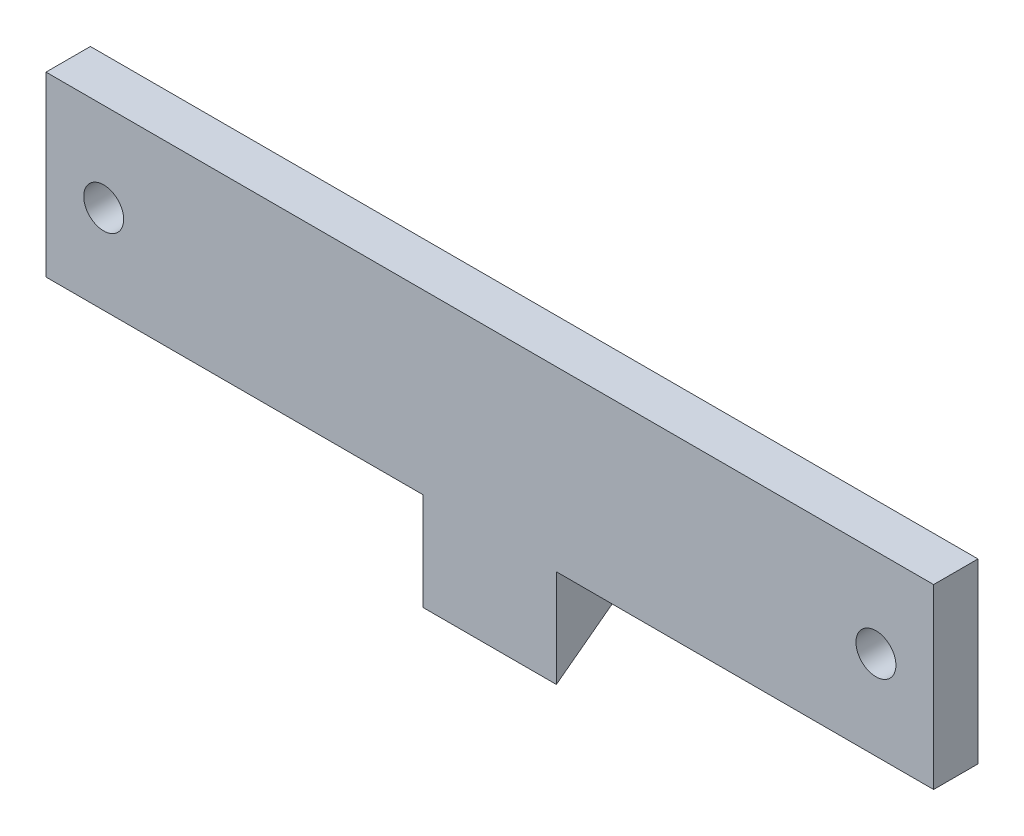
ISO-10303-21;
HEADER;
FILE_DESCRIPTION(('STEP AP214'),'2;1');
FILE_NAME('part.step','',(''),(''),'','','');
FILE_SCHEMA(('AUTOMOTIVE_DESIGN { 1 0 10303 214 1 1 1 1 }'));
ENDSEC;
DATA;
#1=APPLICATION_CONTEXT('core data for automotive mechanical design processes');
#2=APPLICATION_PROTOCOL_DEFINITION('international standard','automotive_design',2000,#1);
#3=PRODUCT_CONTEXT('',#1,'mechanical');
#4=PRODUCT('Part','Part','',(#3));
#5=PRODUCT_RELATED_PRODUCT_CATEGORY('part','',(#4));
#6=PRODUCT_DEFINITION_FORMATION('','',#4);
#7=PRODUCT_DEFINITION_CONTEXT('part definition',#1,'design');
#8=PRODUCT_DEFINITION('design','',#6,#7);
#9=PRODUCT_DEFINITION_SHAPE('','',#8);
#10=(LENGTH_UNIT() NAMED_UNIT(*) SI_UNIT(.MILLI.,.METRE.));
#11=(NAMED_UNIT(*) PLANE_ANGLE_UNIT() SI_UNIT($,.RADIAN.));
#12=(NAMED_UNIT(*) SI_UNIT($,.STERADIAN.) SOLID_ANGLE_UNIT());
#13=UNCERTAINTY_MEASURE_WITH_UNIT(LENGTH_MEASURE(1.E-05),#10,'distance_accuracy_value','');
#14=(GEOMETRIC_REPRESENTATION_CONTEXT(3) GLOBAL_UNCERTAINTY_ASSIGNED_CONTEXT((#13)) GLOBAL_UNIT_ASSIGNED_CONTEXT((#10,
#11,#12)) REPRESENTATION_CONTEXT('',''));
#15=CARTESIAN_POINT('',(0.,0.,0.));
#16=DIRECTION('',(0.,0.,1.));
#17=DIRECTION('',(1.,0.,0.));
#18=AXIS2_PLACEMENT_3D('',#15,#16,#17);
#19=CARTESIAN_POINT('',(-50.,-10.,5.));
#20=DIRECTION('',(0.,1.,0.));
#21=DIRECTION('',(0.,0.,1.));
#22=AXIS2_PLACEMENT_3D('',#19,#20,#21);
#23=PLANE('',#22);
#24=DIRECTION('',(1.,0.,0.));
#25=VECTOR('',#24,1.);
#26=CARTESIAN_POINT('',(-50.,-10.,5.));
#27=LINE('',#26,#25);
#28=CARTESIAN_POINT('',(7.5,-10.,5.));
#29=VERTEX_POINT('',#28);
#30=CARTESIAN_POINT('',(50.,-10.,5.));
#31=VERTEX_POINT('',#30);
#32=EDGE_CURVE('E68',#29,#31,#27,.T.);
#33=ORIENTED_EDGE('',*,*,#32,.F.);
#34=DIRECTION('',(0.,0.,-1.));
#35=VECTOR('',#34,1.);
#36=CARTESIAN_POINT('',(7.5,-10.,5.));
#37=LINE('',#36,#35);
#38=CARTESIAN_POINT('',(7.5,-10.,0.));
#39=VERTEX_POINT('',#38);
#40=EDGE_CURVE('E164',#29,#39,#37,.T.);
#41=ORIENTED_EDGE('',*,*,#40,.T.);
#42=DIRECTION('',(1.,0.,0.));
#43=VECTOR('',#42,1.);
#44=CARTESIAN_POINT('',(-50.,-10.,0.));
#45=LINE('',#44,#43);
#46=CARTESIAN_POINT('',(50.,-10.,0.));
#47=VERTEX_POINT('',#46);
#48=EDGE_CURVE('E90',#39,#47,#45,.T.);
#49=ORIENTED_EDGE('',*,*,#48,.T.);
#50=DIRECTION('',(0.,0.,-1.));
#51=VECTOR('',#50,1.);
#52=CARTESIAN_POINT('',(50.,-10.,5.));
#53=LINE('',#52,#51);
#54=EDGE_CURVE('E207',#31,#47,#53,.T.);
#55=ORIENTED_EDGE('',*,*,#54,.F.);
#56=EDGE_LOOP('',(#33,#41,#49,#55));
#57=FACE_BOUND('',#56,.T.);
#58=ADVANCED_FACE('F43',(#57),#23,.F.);
#59=CARTESIAN_POINT('',(50.,10.,5.));
#60=DIRECTION('',(-1.,0.,0.));
#61=DIRECTION('',(0.,0.,1.));
#62=AXIS2_PLACEMENT_3D('',#59,#60,#61);
#63=PLANE('',#62);
#64=DIRECTION('',(0.,1.,0.));
#65=VECTOR('',#64,1.);
#66=CARTESIAN_POINT('',(50.,10.,0.));
#67=LINE('',#66,#65);
#68=CARTESIAN_POINT('',(50.,10.,0.));
#69=VERTEX_POINT('',#68);
#70=EDGE_CURVE('E193',#47,#69,#67,.T.);
#71=ORIENTED_EDGE('',*,*,#70,.T.);
#72=DIRECTION('',(0.,0.,-1.));
#73=VECTOR('',#72,1.);
#74=CARTESIAN_POINT('',(50.,10.,5.));
#75=LINE('',#74,#73);
#76=CARTESIAN_POINT('',(50.,10.,5.));
#77=VERTEX_POINT('',#76);
#78=EDGE_CURVE('E11',#77,#69,#75,.T.);
#79=ORIENTED_EDGE('',*,*,#78,.F.);
#80=DIRECTION('',(0.,1.,0.));
#81=VECTOR('',#80,1.);
#82=CARTESIAN_POINT('',(50.,10.,5.));
#83=LINE('',#82,#81);
#84=EDGE_CURVE('E194',#31,#77,#83,.T.);
#85=ORIENTED_EDGE('',*,*,#84,.F.);
#86=ORIENTED_EDGE('',*,*,#54,.T.);
#87=EDGE_LOOP('',(#71,#79,#85,#86));
#88=FACE_BOUND('',#87,.T.);
#89=ADVANCED_FACE('F45',(#88),#63,.F.);
#90=CARTESIAN_POINT('',(-50.,10.,5.));
#91=DIRECTION('',(0.,-1.,0.));
#92=DIRECTION('',(0.,0.,-1.));
#93=AXIS2_PLACEMENT_3D('',#90,#91,#92);
#94=PLANE('',#93);
#95=DIRECTION('',(-1.,0.,0.));
#96=VECTOR('',#95,1.);
#97=CARTESIAN_POINT('',(-50.,10.,0.));
#98=LINE('',#97,#96);
#99=CARTESIAN_POINT('',(-50.,10.,0.));
#100=VERTEX_POINT('',#99);
#101=EDGE_CURVE('E211',#69,#100,#98,.T.);
#102=ORIENTED_EDGE('',*,*,#101,.T.);
#103=DIRECTION('',(0.,0.,-1.));
#104=VECTOR('',#103,1.);
#105=CARTESIAN_POINT('',(-50.,10.,5.));
#106=LINE('',#105,#104);
#107=CARTESIAN_POINT('',(-50.,10.,5.));
#108=VERTEX_POINT('',#107);
#109=EDGE_CURVE('E52',#108,#100,#106,.T.);
#110=ORIENTED_EDGE('',*,*,#109,.F.);
#111=DIRECTION('',(-1.,0.,0.));
#112=VECTOR('',#111,1.);
#113=CARTESIAN_POINT('',(-50.,10.,5.));
#114=LINE('',#113,#112);
#115=EDGE_CURVE('E97',#77,#108,#114,.T.);
#116=ORIENTED_EDGE('',*,*,#115,.F.);
#117=ORIENTED_EDGE('',*,*,#78,.T.);
#118=EDGE_LOOP('',(#102,#110,#116,#117));
#119=FACE_BOUND('',#118,.T.);
#120=ADVANCED_FACE('F246',(#119),#94,.F.);
#121=CARTESIAN_POINT('',(-50.,10.,5.));
#122=DIRECTION('',(1.,0.,0.));
#123=DIRECTION('',(0.,0.,-1.));
#124=AXIS2_PLACEMENT_3D('',#121,#122,#123);
#125=PLANE('',#124);
#126=DIRECTION('',(0.,-1.,0.));
#127=VECTOR('',#126,1.);
#128=CARTESIAN_POINT('',(-50.,10.,0.));
#129=LINE('',#128,#127);
#130=CARTESIAN_POINT('',(-50.,-10.,0.));
#131=VERTEX_POINT('',#130);
#132=EDGE_CURVE('E214',#100,#131,#129,.T.);
#133=ORIENTED_EDGE('',*,*,#132,.T.);
#134=DIRECTION('',(0.,0.,-1.));
#135=VECTOR('',#134,1.);
#136=CARTESIAN_POINT('',(-50.,-10.,5.));
#137=LINE('',#136,#135);
#138=CARTESIAN_POINT('',(-50.,-10.,5.));
#139=VERTEX_POINT('',#138);
#140=EDGE_CURVE('E222',#139,#131,#137,.T.);
#141=ORIENTED_EDGE('',*,*,#140,.F.);
#142=DIRECTION('',(0.,-1.,0.));
#143=VECTOR('',#142,1.);
#144=CARTESIAN_POINT('',(-50.,10.,5.));
#145=LINE('',#144,#143);
#146=EDGE_CURVE('E200',#108,#139,#145,.T.);
#147=ORIENTED_EDGE('',*,*,#146,.F.);
#148=ORIENTED_EDGE('',*,*,#109,.T.);
#149=EDGE_LOOP('',(#133,#141,#147,#148));
#150=FACE_BOUND('',#149,.T.);
#151=ADVANCED_FACE('F230',(#150),#125,.F.);
#152=CARTESIAN_POINT('',(-7.5,-10.,0.));
#153=VERTEX_POINT('',#152);
#154=EDGE_CURVE('E197',#131,#153,#45,.T.);
#155=ORIENTED_EDGE('',*,*,#154,.T.);
#156=DIRECTION('',(0.,0.,1.));
#157=VECTOR('',#156,1.);
#158=CARTESIAN_POINT('',(-7.5,-10.,5.));
#159=LINE('',#158,#157);
#160=CARTESIAN_POINT('',(-7.5,-10.,5.));
#161=VERTEX_POINT('',#160);
#162=EDGE_CURVE('E159',#153,#161,#159,.T.);
#163=ORIENTED_EDGE('',*,*,#162,.T.);
#164=EDGE_CURVE('E203',#139,#161,#27,.T.);
#165=ORIENTED_EDGE('',*,*,#164,.F.);
#166=ORIENTED_EDGE('',*,*,#140,.T.);
#167=EDGE_LOOP('',(#155,#163,#165,#166));
#168=FACE_BOUND('',#167,.T.);
#169=ADVANCED_FACE('F240',(#168),#23,.F.);
#170=CARTESIAN_POINT('',(0.,0.,5.));
#171=DIRECTION('',(0.,0.,1.));
#172=DIRECTION('',(1.,0.,0.));
#173=AXIS2_PLACEMENT_3D('',#170,#171,#172);
#174=PLANE('',#173);
#175=CARTESIAN_POINT('',(-43.5,0.,5.));
#176=DIRECTION('',(0.,0.,1.));
#177=DIRECTION('',(1.,0.,0.));
#178=AXIS2_PLACEMENT_3D('',#175,#176,#177);
#179=CIRCLE('',#178,2.24999999999999);
#180=CARTESIAN_POINT('',(-41.25,0.,5.));
#181=VERTEX_POINT('',#180);
#182=EDGE_CURVE('E175',#181,#181,#179,.T.);
#183=ORIENTED_EDGE('',*,*,#182,.F.);
#184=EDGE_LOOP('',(#183));
#185=FACE_BOUND('',#184,.T.);
#186=CARTESIAN_POINT('',(43.5,0.,5.));
#187=DIRECTION('',(0.,0.,1.));
#188=DIRECTION('',(1.,0.,0.));
#189=AXIS2_PLACEMENT_3D('',#186,#187,#188);
#190=CIRCLE('',#189,2.24999999999999);
#191=CARTESIAN_POINT('',(45.75,0.,5.));
#192=VERTEX_POINT('',#191);
#193=EDGE_CURVE('E185',#192,#192,#190,.T.);
#194=ORIENTED_EDGE('',*,*,#193,.F.);
#195=EDGE_LOOP('',(#194));
#196=FACE_BOUND('',#195,.T.);
#197=ORIENTED_EDGE('',*,*,#84,.T.);
#198=ORIENTED_EDGE('',*,*,#115,.T.);
#199=ORIENTED_EDGE('',*,*,#146,.T.);
#200=ORIENTED_EDGE('',*,*,#164,.T.);
#201=DIRECTION('',(0.,1.,0.));
#202=VECTOR('',#201,1.);
#203=CARTESIAN_POINT('',(-7.5,-15.,5.));
#204=LINE('',#203,#202);
#205=CARTESIAN_POINT('',(-7.5,-21.,5.));
#206=VERTEX_POINT('',#205);
#207=EDGE_CURVE('E59',#206,#161,#204,.T.);
#208=ORIENTED_EDGE('',*,*,#207,.F.);
#209=DIRECTION('',(-1.,0.,0.));
#210=VECTOR('',#209,1.);
#211=CARTESIAN_POINT('',(-7.5,-21.,5.));
#212=LINE('',#211,#210);
#213=CARTESIAN_POINT('',(7.5,-21.,5.));
#214=VERTEX_POINT('',#213);
#215=EDGE_CURVE('E141',#214,#206,#212,.T.);
#216=ORIENTED_EDGE('',*,*,#215,.F.);
#217=DIRECTION('',(0.,1.,0.));
#218=VECTOR('',#217,1.);
#219=CARTESIAN_POINT('',(7.5,-15.,5.));
#220=LINE('',#219,#218);
#221=EDGE_CURVE('E149',#214,#29,#220,.T.);
#222=ORIENTED_EDGE('',*,*,#221,.T.);
#223=ORIENTED_EDGE('',*,*,#32,.T.);
#224=EDGE_LOOP('',(#197,#198,#199,#200,#208,#216,#222,#223));
#225=FACE_BOUND('',#224,.T.);
#226=ADVANCED_FACE('F242',(#185,#196,#225),#174,.T.);
#227=CARTESIAN_POINT('',(0.,0.,0.));
#228=DIRECTION('',(0.,0.,1.));
#229=DIRECTION('',(1.,0.,0.));
#230=AXIS2_PLACEMENT_3D('',#227,#228,#229);
#231=PLANE('',#230);
#232=CARTESIAN_POINT('',(-43.5,0.,0.));
#233=DIRECTION('',(0.,0.,1.));
#234=DIRECTION('',(1.,0.,0.));
#235=AXIS2_PLACEMENT_3D('',#232,#233,#234);
#236=CIRCLE('',#235,2.25);
#237=CARTESIAN_POINT('',(-41.25,0.,0.));
#238=VERTEX_POINT('',#237);
#239=EDGE_CURVE('E181',#238,#238,#236,.T.);
#240=ORIENTED_EDGE('',*,*,#239,.T.);
#241=EDGE_LOOP('',(#240));
#242=FACE_BOUND('',#241,.T.);
#243=CARTESIAN_POINT('',(43.5,0.,0.));
#244=DIRECTION('',(0.,0.,1.));
#245=DIRECTION('',(1.,0.,0.));
#246=AXIS2_PLACEMENT_3D('',#243,#244,#245);
#247=CIRCLE('',#246,2.25);
#248=CARTESIAN_POINT('',(45.75,0.,0.));
#249=VERTEX_POINT('',#248);
#250=EDGE_CURVE('E189',#249,#249,#247,.T.);
#251=ORIENTED_EDGE('',*,*,#250,.T.);
#252=EDGE_LOOP('',(#251));
#253=FACE_BOUND('',#252,.T.);
#254=ORIENTED_EDGE('',*,*,#48,.F.);
#255=DIRECTION('',(-1.,0.,0.));
#256=VECTOR('',#255,1.);
#257=CARTESIAN_POINT('',(-7.5,-10.,0.));
#258=LINE('',#257,#256);
#259=EDGE_CURVE('E238',#39,#153,#258,.T.);
#260=ORIENTED_EDGE('',*,*,#259,.T.);
#261=ORIENTED_EDGE('',*,*,#154,.F.);
#262=ORIENTED_EDGE('',*,*,#132,.F.);
#263=ORIENTED_EDGE('',*,*,#101,.F.);
#264=ORIENTED_EDGE('',*,*,#70,.F.);
#265=EDGE_LOOP('',(#254,#260,#261,#262,#263,#264));
#266=FACE_BOUND('',#265,.T.);
#267=ADVANCED_FACE('F234',(#242,#253,#266),#231,.F.);
#268=CARTESIAN_POINT('',(43.5,0.,5.));
#269=DIRECTION('',(0.,0.,1.));
#270=DIRECTION('',(1.,0.,0.));
#271=AXIS2_PLACEMENT_3D('',#268,#269,#270);
#272=CYLINDRICAL_SURFACE('',#271,2.25);
#273=ORIENTED_EDGE('',*,*,#250,.F.);
#274=EDGE_LOOP('',(#273));
#275=FACE_BOUND('',#274,.T.);
#276=ORIENTED_EDGE('',*,*,#193,.T.);
#277=EDGE_LOOP('',(#276));
#278=FACE_BOUND('',#277,.T.);
#279=ADVANCED_FACE('F270',(#275,#278),#272,.F.);
#280=CARTESIAN_POINT('',(-43.5,0.,5.));
#281=DIRECTION('',(0.,0.,1.));
#282=DIRECTION('',(1.,0.,0.));
#283=AXIS2_PLACEMENT_3D('',#280,#281,#282);
#284=CYLINDRICAL_SURFACE('',#283,2.25);
#285=ORIENTED_EDGE('',*,*,#239,.F.);
#286=EDGE_LOOP('',(#285));
#287=FACE_BOUND('',#286,.T.);
#288=ORIENTED_EDGE('',*,*,#182,.T.);
#289=EDGE_LOOP('',(#288));
#290=FACE_BOUND('',#289,.T.);
#291=ADVANCED_FACE('F277',(#287,#290),#284,.F.);
#292=CARTESIAN_POINT('',(7.5,-15.,5.));
#293=DIRECTION('',(1.,0.,0.));
#294=DIRECTION('',(0.,0.,-1.));
#295=AXIS2_PLACEMENT_3D('',#292,#293,#294);
#296=PLANE('',#295);
#297=DIRECTION('',(0.,-0.6,0.8));
#298=VECTOR('',#297,1.);
#299=CARTESIAN_POINT('',(7.5,-21.,5.));
#300=LINE('',#299,#298);
#301=CARTESIAN_POINT('',(7.5,-15.,-3.));
#302=VERTEX_POINT('',#301);
#303=EDGE_CURVE('E134',#302,#214,#300,.T.);
#304=ORIENTED_EDGE('',*,*,#303,.F.);
#305=DIRECTION('',(0.,0.,-1.));
#306=VECTOR('',#305,1.);
#307=CARTESIAN_POINT('',(7.5,-15.,5.));
#308=LINE('',#307,#306);
#309=CARTESIAN_POINT('',(7.5,-15.,-7.35));
#310=VERTEX_POINT('',#309);
#311=EDGE_CURVE('E146',#302,#310,#308,.T.);
#312=ORIENTED_EDGE('',*,*,#311,.T.);
#313=DIRECTION('',(0.,1.,0.));
#314=VECTOR('',#313,1.);
#315=CARTESIAN_POINT('',(7.5,-15.,-7.35));
#316=LINE('',#315,#314);
#317=CARTESIAN_POINT('',(7.5,-10.,-7.35));
#318=VERTEX_POINT('',#317);
#319=EDGE_CURVE('E440',#310,#318,#316,.T.);
#320=ORIENTED_EDGE('',*,*,#319,.T.);
#321=DIRECTION('',(0.,0.,1.));
#322=VECTOR('',#321,1.);
#323=CARTESIAN_POINT('',(7.5,-10.,-7.35));
#324=LINE('',#323,#322);
#325=EDGE_CURVE('E167',#318,#39,#324,.T.);
#326=ORIENTED_EDGE('',*,*,#325,.T.);
#327=ORIENTED_EDGE('',*,*,#40,.F.);
#328=ORIENTED_EDGE('',*,*,#221,.F.);
#329=EDGE_LOOP('',(#304,#312,#320,#326,#327,#328));
#330=FACE_BOUND('',#329,.T.);
#331=ADVANCED_FACE('F144',(#330),#296,.T.);
#332=CARTESIAN_POINT('',(-7.5,-15.,5.));
#333=DIRECTION('',(-1.,0.,0.));
#334=DIRECTION('',(0.,0.,1.));
#335=AXIS2_PLACEMENT_3D('',#332,#333,#334);
#336=PLANE('',#335);
#337=DIRECTION('',(0.,0.6,-0.8));
#338=VECTOR('',#337,1.);
#339=CARTESIAN_POINT('',(-7.5,-18.84,2.12));
#340=LINE('',#339,#338);
#341=CARTESIAN_POINT('',(-7.5,-15.,-3.));
#342=VERTEX_POINT('',#341);
#343=EDGE_CURVE('E136',#206,#342,#340,.T.);
#344=ORIENTED_EDGE('',*,*,#343,.F.);
#345=ORIENTED_EDGE('',*,*,#207,.T.);
#346=ORIENTED_EDGE('',*,*,#162,.F.);
#347=DIRECTION('',(0.,0.,1.));
#348=VECTOR('',#347,1.);
#349=CARTESIAN_POINT('',(-7.5,-10.,-7.35));
#350=LINE('',#349,#348);
#351=CARTESIAN_POINT('',(-7.5,-10.,-7.35));
#352=VERTEX_POINT('',#351);
#353=EDGE_CURVE('E171',#352,#153,#350,.T.);
#354=ORIENTED_EDGE('',*,*,#353,.F.);
#355=DIRECTION('',(0.,-1.,0.));
#356=VECTOR('',#355,1.);
#357=CARTESIAN_POINT('',(-7.5,-15.,-7.35));
#358=LINE('',#357,#356);
#359=CARTESIAN_POINT('',(-7.5,-15.,-7.35));
#360=VERTEX_POINT('',#359);
#361=EDGE_CURVE('E434',#352,#360,#358,.T.);
#362=ORIENTED_EDGE('',*,*,#361,.T.);
#363=DIRECTION('',(0.,0.,1.));
#364=VECTOR('',#363,1.);
#365=CARTESIAN_POINT('',(-7.5,-15.,5.));
#366=LINE('',#365,#364);
#367=EDGE_CURVE('E158',#360,#342,#366,.T.);
#368=ORIENTED_EDGE('',*,*,#367,.T.);
#369=EDGE_LOOP('',(#344,#345,#346,#354,#362,#368));
#370=FACE_BOUND('',#369,.T.);
#371=ADVANCED_FACE('F283',(#370),#336,.T.);
#372=CARTESIAN_POINT('',(0.,-15.,0.));
#373=DIRECTION('',(0.,-1.,0.));
#374=DIRECTION('',(0.,0.,-1.));
#375=AXIS2_PLACEMENT_3D('',#372,#373,#374);
#376=PLANE('',#375);
#377=DIRECTION('',(1.,0.,0.));
#378=VECTOR('',#377,1.);
#379=CARTESIAN_POINT('',(-7.5,-15.,-3.));
#380=LINE('',#379,#378);
#381=EDGE_CURVE('E131',#342,#302,#380,.T.);
#382=ORIENTED_EDGE('',*,*,#381,.F.);
#383=ORIENTED_EDGE('',*,*,#367,.F.);
#384=DIRECTION('',(1.,0.,0.));
#385=VECTOR('',#384,1.);
#386=CARTESIAN_POINT('',(-7.5,-15.,-7.35));
#387=LINE('',#386,#385);
#388=EDGE_CURVE('E156',#360,#310,#387,.T.);
#389=ORIENTED_EDGE('',*,*,#388,.T.);
#390=ORIENTED_EDGE('',*,*,#311,.F.);
#391=EDGE_LOOP('',(#382,#383,#389,#390));
#392=FACE_BOUND('',#391,.T.);
#393=ADVANCED_FACE('F154',(#392),#376,.T.);
#394=CARTESIAN_POINT('',(-7.5,-10.,-7.35));
#395=DIRECTION('',(0.,1.,0.));
#396=DIRECTION('',(0.,0.,1.));
#397=AXIS2_PLACEMENT_3D('',#394,#395,#396);
#398=PLANE('',#397);
#399=ORIENTED_EDGE('',*,*,#259,.F.);
#400=ORIENTED_EDGE('',*,*,#325,.F.);
#401=DIRECTION('',(-1.,0.,0.));
#402=VECTOR('',#401,1.);
#403=CARTESIAN_POINT('',(-7.5,-10.,-7.35));
#404=LINE('',#403,#402);
#405=EDGE_CURVE('E436',#318,#352,#404,.T.);
#406=ORIENTED_EDGE('',*,*,#405,.T.);
#407=ORIENTED_EDGE('',*,*,#353,.T.);
#408=EDGE_LOOP('',(#399,#400,#406,#407));
#409=FACE_BOUND('',#408,.T.);
#410=ADVANCED_FACE('F288',(#409),#398,.T.);
#411=CARTESIAN_POINT('',(0.,0.,-7.35));
#412=DIRECTION('',(0.,0.,-1.));
#413=DIRECTION('',(-1.,0.,0.));
#414=AXIS2_PLACEMENT_3D('',#411,#412,#413);
#415=PLANE('',#414);
#416=ORIENTED_EDGE('',*,*,#361,.F.);
#417=ORIENTED_EDGE('',*,*,#405,.F.);
#418=ORIENTED_EDGE('',*,*,#319,.F.);
#419=ORIENTED_EDGE('',*,*,#388,.F.);
#420=EDGE_LOOP('',(#416,#417,#418,#419));
#421=FACE_BOUND('',#420,.T.);
#422=ADVANCED_FACE('F291',(#421),#415,.T.);
#423=CARTESIAN_POINT('',(-50.,-21.,5.));
#424=DIRECTION('',(0.,0.8,0.6));
#425=DIRECTION('',(0.,-0.6,0.8));
#426=AXIS2_PLACEMENT_3D('',#423,#424,#425);
#427=PLANE('',#426);
#428=ORIENTED_EDGE('',*,*,#343,.T.);
#429=ORIENTED_EDGE('',*,*,#381,.T.);
#430=ORIENTED_EDGE('',*,*,#303,.T.);
#431=ORIENTED_EDGE('',*,*,#215,.T.);
#432=EDGE_LOOP('',(#428,#429,#430,#431));
#433=FACE_BOUND('',#432,.T.);
#434=ADVANCED_FACE('F133',(#433),#427,.F.);
#435=CLOSED_SHELL('',(#58,#89,#120,#151,#169,#226,#267,#279,#291,#331,#371,#393,#410,#422,#434));
#436=MANIFOLD_SOLID_BREP('B2',#435);
#437=ADVANCED_BREP_SHAPE_REPRESENTATION('',(#18,#436),#14);
#438=SHAPE_DEFINITION_REPRESENTATION(#9,#437);
ENDSEC;
END-ISO-10303-21;
